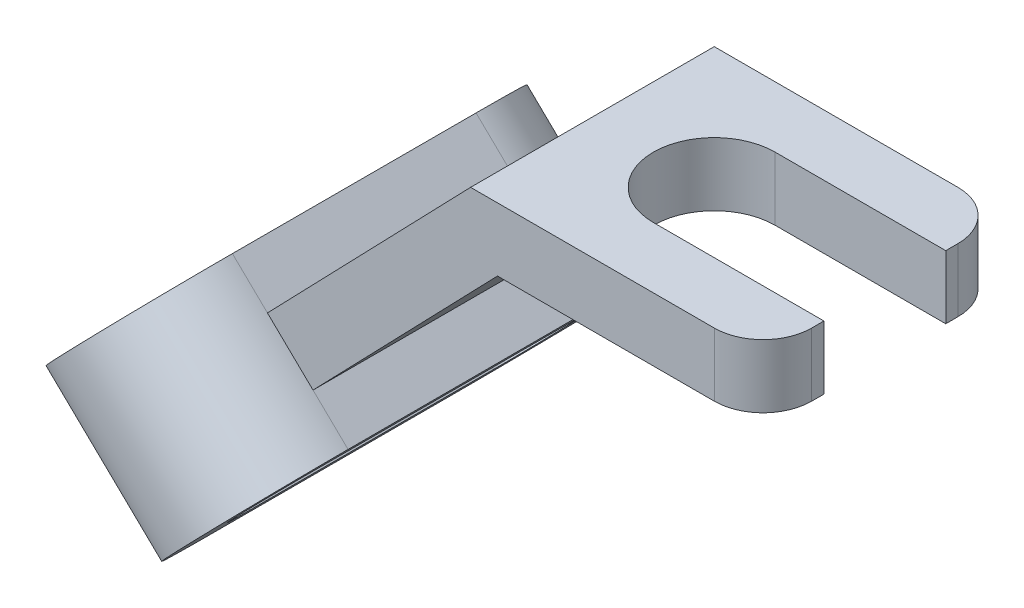
ISO-10303-21;
HEADER;
FILE_DESCRIPTION(('STEP AP214'),'2;1');
FILE_NAME('part.step','',(''),(''),'','','');
FILE_SCHEMA(('AUTOMOTIVE_DESIGN { 1 0 10303 214 1 1 1 1 }'));
ENDSEC;
DATA;
#1=APPLICATION_CONTEXT('core data for automotive mechanical design processes');
#2=APPLICATION_PROTOCOL_DEFINITION('international standard','automotive_design',2000,#1);
#3=PRODUCT_CONTEXT('',#1,'mechanical');
#4=PRODUCT('Part','Part','',(#3));
#5=PRODUCT_RELATED_PRODUCT_CATEGORY('part','',(#4));
#6=PRODUCT_DEFINITION_FORMATION('','',#4);
#7=PRODUCT_DEFINITION_CONTEXT('part definition',#1,'design');
#8=PRODUCT_DEFINITION('design','',#6,#7);
#9=PRODUCT_DEFINITION_SHAPE('','',#8);
#10=(LENGTH_UNIT() NAMED_UNIT(*) SI_UNIT(.MILLI.,.METRE.));
#11=(NAMED_UNIT(*) PLANE_ANGLE_UNIT() SI_UNIT($,.RADIAN.));
#12=(NAMED_UNIT(*) SI_UNIT($,.STERADIAN.) SOLID_ANGLE_UNIT());
#13=UNCERTAINTY_MEASURE_WITH_UNIT(LENGTH_MEASURE(1.E-05),#10,'distance_accuracy_value','');
#14=(GEOMETRIC_REPRESENTATION_CONTEXT(3) GLOBAL_UNCERTAINTY_ASSIGNED_CONTEXT((#13)) GLOBAL_UNIT_ASSIGNED_CONTEXT((#10,
#11,#12)) REPRESENTATION_CONTEXT('',''));
#15=CARTESIAN_POINT('',(0.,0.,0.));
#16=DIRECTION('',(0.,0.,1.));
#17=DIRECTION('',(1.,0.,0.));
#18=AXIS2_PLACEMENT_3D('',#15,#16,#17);
#19=CARTESIAN_POINT('',(54.4818273892751,0.,50.));
#20=DIRECTION('',(-1.,0.,0.));
#21=DIRECTION('',(0.,0.,1.));
#22=AXIS2_PLACEMENT_3D('',#19,#20,#21);
#23=PLANE('',#22);
#24=DIRECTION('',(0.,0.,-1.));
#25=VECTOR('',#24,1.);
#26=CARTESIAN_POINT('',(54.4818273892751,0.,50.));
#27=LINE('',#26,#25);
#28=CARTESIAN_POINT('',(54.4818273892751,0.,12.5));
#29=VERTEX_POINT('',#28);
#30=CARTESIAN_POINT('',(54.4818273892751,0.,10.));
#31=VERTEX_POINT('',#30);
#32=EDGE_CURVE('E340',#29,#31,#27,.T.);
#33=ORIENTED_EDGE('',*,*,#32,.T.);
#34=DIRECTION('',(0.,1.,0.));
#35=VECTOR('',#34,1.);
#36=CARTESIAN_POINT('',(54.4818273892751,13.,10.));
#37=LINE('',#36,#35);
#38=CARTESIAN_POINT('',(54.4818273892751,13.,10.));
#39=VERTEX_POINT('',#38);
#40=EDGE_CURVE('E359',#31,#39,#37,.T.);
#41=ORIENTED_EDGE('',*,*,#40,.T.);
#42=DIRECTION('',(0.,0.,-1.));
#43=VECTOR('',#42,1.);
#44=CARTESIAN_POINT('',(54.4818273892751,13.,50.));
#45=LINE('',#44,#43);
#46=CARTESIAN_POINT('',(54.4818273892751,13.,12.5));
#47=VERTEX_POINT('',#46);
#48=EDGE_CURVE('E325',#47,#39,#45,.T.);
#49=ORIENTED_EDGE('',*,*,#48,.F.);
#50=DIRECTION('',(0.,1.,0.));
#51=VECTOR('',#50,1.);
#52=CARTESIAN_POINT('',(54.4818273892751,-74.9121225544221,12.5));
#53=LINE('',#52,#51);
#54=EDGE_CURVE('E654',#29,#47,#53,.T.);
#55=ORIENTED_EDGE('',*,*,#54,.F.);
#56=EDGE_LOOP('',(#33,#41,#49,#55));
#57=FACE_BOUND('',#56,.T.);
#58=ADVANCED_FACE('F39',(#57),#23,.F.);
#59=CARTESIAN_POINT('',(-5.51817261072488,13.,50.));
#60=DIRECTION('',(0.719339800338652,-0.694658370458996,0.));
#61=DIRECTION('',(0.694658370458996,0.719339800338652,0.));
#62=AXIS2_PLACEMENT_3D('',#59,#60,#61);
#63=PLANE('',#62);
#64=DIRECTION('',(0.,0.,-1.));
#65=VECTOR('',#64,1.);
#66=CARTESIAN_POINT('',(-47.1976748382646,-30.1603880203191,50.));
#67=LINE('',#66,#65);
#68=CARTESIAN_POINT('',(-47.1976748382646,-30.1603880203191,50.));
#69=VERTEX_POINT('',#68);
#70=CARTESIAN_POINT('',(-47.1976748382646,-30.1603880203191,0.));
#71=VERTEX_POINT('',#70);
#72=EDGE_CURVE('E305',#69,#71,#67,.T.);
#73=ORIENTED_EDGE('',*,*,#72,.F.);
#74=DIRECTION('',(-0.694658370458996,-0.719339800338652,0.));
#75=VECTOR('',#74,1.);
#76=CARTESIAN_POINT('',(-5.51817261072488,13.,50.));
#77=LINE('',#76,#75);
#78=CARTESIAN_POINT('',(-5.51817261072488,13.,50.));
#79=VERTEX_POINT('',#78);
#80=EDGE_CURVE('E313',#79,#69,#77,.T.);
#81=ORIENTED_EDGE('',*,*,#80,.F.);
#82=DIRECTION('',(0.,0.,-1.));
#83=VECTOR('',#82,1.);
#84=CARTESIAN_POINT('',(-5.51817261072488,13.,50.));
#85=LINE('',#84,#83);
#86=CARTESIAN_POINT('',(-5.51817261072488,13.,0.));
#87=VERTEX_POINT('',#86);
#88=EDGE_CURVE('E348',#79,#87,#85,.T.);
#89=ORIENTED_EDGE('',*,*,#88,.T.);
#90=DIRECTION('',(-0.694658370458996,-0.719339800338652,0.));
#91=VECTOR('',#90,1.);
#92=CARTESIAN_POINT('',(-5.51817261072488,13.,0.));
#93=LINE('',#92,#91);
#94=EDGE_CURVE('E328',#87,#71,#93,.T.);
#95=ORIENTED_EDGE('',*,*,#94,.T.);
#96=EDGE_LOOP('',(#73,#81,#89,#95));
#97=FACE_BOUND('',#96,.T.);
#98=ADVANCED_FACE('F390',(#97),#63,.F.);
#99=CARTESIAN_POINT('',(0.,0.,50.));
#100=DIRECTION('',(0.719339800338653,-0.694658370458996,0.));
#101=DIRECTION('',(0.694658370458996,0.719339800338653,0.));
#102=AXIS2_PLACEMENT_3D('',#99,#100,#101);
#103=PLANE('',#102);
#104=DIRECTION('',(-0.694658370458996,-0.719339800338653,0.));
#105=VECTOR('',#104,1.);
#106=CARTESIAN_POINT('',(0.,0.,50.));
#107=LINE('',#106,#105);
#108=CARTESIAN_POINT('',(0.,0.,50.));
#109=VERTEX_POINT('',#108);
#110=CARTESIAN_POINT('',(-37.8462574338621,-39.1909468362861,50.));
#111=VERTEX_POINT('',#110);
#112=EDGE_CURVE('E318',#109,#111,#107,.T.);
#113=ORIENTED_EDGE('',*,*,#112,.T.);
#114=DIRECTION('',(0.,0.,-1.));
#115=VECTOR('',#114,1.);
#116=CARTESIAN_POINT('',(-37.8462574338622,-39.1909468362861,50.));
#117=LINE('',#116,#115);
#118=CARTESIAN_POINT('',(-37.8462574338621,-39.1909468362861,0.));
#119=VERTEX_POINT('',#118);
#120=EDGE_CURVE('E301',#111,#119,#117,.T.);
#121=ORIENTED_EDGE('',*,*,#120,.T.);
#122=DIRECTION('',(-0.694658370458996,-0.719339800338653,0.));
#123=VECTOR('',#122,1.);
#124=CARTESIAN_POINT('',(0.,0.,0.));
#125=LINE('',#124,#123);
#126=CARTESIAN_POINT('',(0.,0.,0.));
#127=VERTEX_POINT('',#126);
#128=EDGE_CURVE('E332',#127,#119,#125,.T.);
#129=ORIENTED_EDGE('',*,*,#128,.F.);
#130=DIRECTION('',(0.,0.,-1.));
#131=VECTOR('',#130,1.);
#132=CARTESIAN_POINT('',(0.,0.,50.));
#133=LINE('',#132,#131);
#134=EDGE_CURVE('E344',#109,#127,#133,.T.);
#135=ORIENTED_EDGE('',*,*,#134,.F.);
#136=EDGE_LOOP('',(#113,#121,#129,#135));
#137=FACE_BOUND('',#136,.T.);
#138=ADVANCED_FACE('F397',(#137),#103,.T.);
#139=CARTESIAN_POINT('',(0.,0.,50.));
#140=DIRECTION('',(0.,0.,-1.));
#141=DIRECTION('',(-1.,0.,0.));
#142=AXIS2_PLACEMENT_3D('',#139,#140,#141);
#143=PLANE('',#142);
#144=DIRECTION('',(-1.,0.,0.));
#145=VECTOR('',#144,1.);
#146=CARTESIAN_POINT('',(54.4818273892751,0.,50.));
#147=LINE('',#146,#145);
#148=CARTESIAN_POINT('',(44.4818273892751,0.,50.));
#149=VERTEX_POINT('',#148);
#150=EDGE_CURVE('E322',#149,#109,#147,.T.);
#151=ORIENTED_EDGE('',*,*,#150,.F.);
#152=DIRECTION('',(0.,1.,0.));
#153=VECTOR('',#152,1.);
#154=CARTESIAN_POINT('',(44.4818273892751,0.,50.));
#155=LINE('',#154,#153);
#156=CARTESIAN_POINT('',(44.4818273892751,13.,50.));
#157=VERTEX_POINT('',#156);
#158=EDGE_CURVE('E48',#149,#157,#155,.T.);
#159=ORIENTED_EDGE('',*,*,#158,.T.);
#160=DIRECTION('',(-1.,0.,0.));
#161=VECTOR('',#160,1.);
#162=CARTESIAN_POINT('',(54.4818273892751,13.,50.));
#163=LINE('',#162,#161);
#164=EDGE_CURVE('E310',#157,#79,#163,.T.);
#165=ORIENTED_EDGE('',*,*,#164,.T.);
#166=ORIENTED_EDGE('',*,*,#80,.T.);
#167=DIRECTION('',(-0.719339800338652,0.694658370458996,0.));
#168=VECTOR('',#167,1.);
#169=CARTESIAN_POINT('',(-30.6528594304756,-46.1375305408761,50.));
#170=LINE('',#169,#168);
#171=EDGE_CURVE('E288',#111,#69,#170,.T.);
#172=ORIENTED_EDGE('',*,*,#171,.F.);
#173=ORIENTED_EDGE('',*,*,#112,.F.);
#174=EDGE_LOOP('',(#151,#159,#165,#166,#172,#173));
#175=FACE_BOUND('',#174,.T.);
#176=ADVANCED_FACE('F381',(#175),#143,.F.);
#177=CARTESIAN_POINT('',(0.,0.,0.));
#178=DIRECTION('',(0.,0.,-1.));
#179=DIRECTION('',(-1.,0.,0.));
#180=AXIS2_PLACEMENT_3D('',#177,#178,#179);
#181=PLANE('',#180);
#182=DIRECTION('',(-1.,0.,0.));
#183=VECTOR('',#182,1.);
#184=CARTESIAN_POINT('',(54.4818273892751,13.,0.));
#185=LINE('',#184,#183);
#186=CARTESIAN_POINT('',(44.4818273892751,13.,0.));
#187=VERTEX_POINT('',#186);
#188=EDGE_CURVE('E309',#187,#87,#185,.T.);
#189=ORIENTED_EDGE('',*,*,#188,.F.);
#190=DIRECTION('',(0.,1.,0.));
#191=VECTOR('',#190,1.);
#192=CARTESIAN_POINT('',(44.4818273892751,0.,0.));
#193=LINE('',#192,#191);
#194=CARTESIAN_POINT('',(44.4818273892751,0.,0.));
#195=VERTEX_POINT('',#194);
#196=EDGE_CURVE('E369',#187,#195,#193,.F.);
#197=ORIENTED_EDGE('',*,*,#196,.T.);
#198=DIRECTION('',(-1.,0.,0.));
#199=VECTOR('',#198,1.);
#200=CARTESIAN_POINT('',(54.4818273892751,0.,0.));
#201=LINE('',#200,#199);
#202=EDGE_CURVE('E314',#195,#127,#201,.T.);
#203=ORIENTED_EDGE('',*,*,#202,.T.);
#204=ORIENTED_EDGE('',*,*,#128,.T.);
#205=DIRECTION('',(-0.719339800338653,0.694658370458996,0.));
#206=VECTOR('',#205,1.);
#207=CARTESIAN_POINT('',(-37.8462574338622,-39.1909468362861,0.));
#208=LINE('',#207,#206);
#209=EDGE_CURVE('E355',#119,#71,#208,.T.);
#210=ORIENTED_EDGE('',*,*,#209,.T.);
#211=ORIENTED_EDGE('',*,*,#94,.F.);
#212=EDGE_LOOP('',(#189,#197,#203,#204,#210,#211));
#213=FACE_BOUND('',#212,.T.);
#214=ADVANCED_FACE('F441',(#213),#181,.T.);
#215=CARTESIAN_POINT('',(54.4818273892751,13.,50.));
#216=DIRECTION('',(0.,-1.,0.));
#217=DIRECTION('',(1.,0.,0.));
#218=AXIS2_PLACEMENT_3D('',#215,#216,#217);
#219=PLANE('',#218);
#220=ORIENTED_EDGE('',*,*,#48,.T.);
#221=CARTESIAN_POINT('',(44.4818273892751,13.,10.));
#222=DIRECTION('',(0.,-1.,0.));
#223=DIRECTION('',(1.,0.,0.));
#224=AXIS2_PLACEMENT_3D('',#221,#222,#223);
#225=CIRCLE('',#224,10.);
#226=EDGE_CURVE('E366',#39,#187,#225,.F.);
#227=ORIENTED_EDGE('',*,*,#226,.T.);
#228=ORIENTED_EDGE('',*,*,#188,.T.);
#229=ORIENTED_EDGE('',*,*,#88,.F.);
#230=ORIENTED_EDGE('',*,*,#164,.F.);
#231=CARTESIAN_POINT('',(44.4818273892751,13.,40.));
#232=DIRECTION('',(0.,-1.,0.));
#233=DIRECTION('',(1.,0.,0.));
#234=AXIS2_PLACEMENT_3D('',#231,#232,#233);
#235=CIRCLE('',#234,10.);
#236=CARTESIAN_POINT('',(54.4818273892751,13.,40.));
#237=VERTEX_POINT('',#236);
#238=EDGE_CURVE('E363',#157,#237,#235,.F.);
#239=ORIENTED_EDGE('',*,*,#238,.T.);
#240=CARTESIAN_POINT('',(54.4818273892751,13.,37.5));
#241=VERTEX_POINT('',#240);
#242=EDGE_CURVE('E203',#237,#241,#45,.T.);
#243=ORIENTED_EDGE('',*,*,#242,.T.);
#244=DIRECTION('',(1.,0.,0.));
#245=VECTOR('',#244,1.);
#246=CARTESIAN_POINT('',(19.4818273892751,13.,37.5));
#247=LINE('',#246,#245);
#248=CARTESIAN_POINT('',(19.4818273892751,13.,37.5));
#249=VERTEX_POINT('',#248);
#250=EDGE_CURVE('E181',#249,#241,#247,.T.);
#251=ORIENTED_EDGE('',*,*,#250,.F.);
#252=CARTESIAN_POINT('',(19.4818273892751,13.,25.));
#253=DIRECTION('',(0.,1.,0.));
#254=DIRECTION('',(-1.,0.,0.));
#255=AXIS2_PLACEMENT_3D('',#252,#253,#254);
#256=CIRCLE('',#255,12.5);
#257=CARTESIAN_POINT('',(19.4818273892751,13.,12.5));
#258=VERTEX_POINT('',#257);
#259=EDGE_CURVE('E193',#258,#249,#256,.T.);
#260=ORIENTED_EDGE('',*,*,#259,.F.);
#261=DIRECTION('',(-1.,0.,0.));
#262=VECTOR('',#261,1.);
#263=CARTESIAN_POINT('',(19.4818273892751,13.,12.5));
#264=LINE('',#263,#262);
#265=EDGE_CURVE('E190',#47,#258,#264,.T.);
#266=ORIENTED_EDGE('',*,*,#265,.F.);
#267=EDGE_LOOP('',(#220,#227,#228,#229,#230,#239,#243,#251,#260,#266));
#268=FACE_BOUND('',#267,.T.);
#269=ADVANCED_FACE('F202',(#268),#219,.F.);
#270=CARTESIAN_POINT('',(54.4818273892751,0.,50.));
#271=DIRECTION('',(0.,-1.,0.));
#272=DIRECTION('',(0.,0.,-1.));
#273=AXIS2_PLACEMENT_3D('',#270,#271,#272);
#274=PLANE('',#273);
#275=ORIENTED_EDGE('',*,*,#202,.F.);
#276=CARTESIAN_POINT('',(44.4818273892751,0.,10.));
#277=DIRECTION('',(0.,-1.,0.));
#278=DIRECTION('',(0.,0.,-1.));
#279=AXIS2_PLACEMENT_3D('',#276,#277,#278);
#280=CIRCLE('',#279,10.);
#281=EDGE_CURVE('E374',#195,#31,#280,.T.);
#282=ORIENTED_EDGE('',*,*,#281,.T.);
#283=ORIENTED_EDGE('',*,*,#32,.F.);
#284=DIRECTION('',(-1.,0.,0.));
#285=VECTOR('',#284,1.);
#286=CARTESIAN_POINT('',(19.4818273892751,0.,12.5));
#287=LINE('',#286,#285);
#288=CARTESIAN_POINT('',(19.4818273892751,0.,12.5));
#289=VERTEX_POINT('',#288);
#290=EDGE_CURVE('E199',#29,#289,#287,.T.);
#291=ORIENTED_EDGE('',*,*,#290,.T.);
#292=CARTESIAN_POINT('',(19.4818273892751,0.,25.));
#293=DIRECTION('',(0.,-1.,0.));
#294=DIRECTION('',(0.,0.,-1.));
#295=AXIS2_PLACEMENT_3D('',#292,#293,#294);
#296=CIRCLE('',#295,12.5);
#297=CARTESIAN_POINT('',(19.4818273892751,0.,37.5));
#298=VERTEX_POINT('',#297);
#299=EDGE_CURVE('E657',#289,#298,#296,.F.);
#300=ORIENTED_EDGE('',*,*,#299,.T.);
#301=DIRECTION('',(1.,0.,0.));
#302=VECTOR('',#301,1.);
#303=CARTESIAN_POINT('',(19.4818273892751,0.,37.5));
#304=LINE('',#303,#302);
#305=CARTESIAN_POINT('',(54.4818273892751,0.,37.5));
#306=VERTEX_POINT('',#305);
#307=EDGE_CURVE('E184',#298,#306,#304,.T.);
#308=ORIENTED_EDGE('',*,*,#307,.T.);
#309=CARTESIAN_POINT('',(54.4818273892751,0.,40.));
#310=VERTEX_POINT('',#309);
#311=EDGE_CURVE('E341',#310,#306,#27,.T.);
#312=ORIENTED_EDGE('',*,*,#311,.F.);
#313=CARTESIAN_POINT('',(44.4818273892751,0.,40.));
#314=DIRECTION('',(0.,-1.,0.));
#315=DIRECTION('',(0.,0.,-1.));
#316=AXIS2_PLACEMENT_3D('',#313,#314,#315);
#317=CIRCLE('',#316,10.);
#318=EDGE_CURVE('E55',#310,#149,#317,.T.);
#319=ORIENTED_EDGE('',*,*,#318,.T.);
#320=ORIENTED_EDGE('',*,*,#150,.T.);
#321=ORIENTED_EDGE('',*,*,#134,.T.);
#322=EDGE_LOOP('',(#275,#282,#283,#291,#300,#308,#312,#319,#320,#321));
#323=FACE_BOUND('',#322,.T.);
#324=ADVANCED_FACE('F400',(#323),#274,.T.);
#325=ORIENTED_EDGE('',*,*,#242,.F.);
#326=DIRECTION('',(0.,1.,0.));
#327=VECTOR('',#326,1.);
#328=CARTESIAN_POINT('',(54.4818273892751,0.,40.));
#329=LINE('',#328,#327);
#330=EDGE_CURVE('E11',#237,#310,#329,.F.);
#331=ORIENTED_EDGE('',*,*,#330,.T.);
#332=ORIENTED_EDGE('',*,*,#311,.T.);
#333=DIRECTION('',(0.,-1.,0.));
#334=VECTOR('',#333,1.);
#335=CARTESIAN_POINT('',(54.4818273892751,-74.9121225544221,37.5));
#336=LINE('',#335,#334);
#337=EDGE_CURVE('E465',#241,#306,#336,.T.);
#338=ORIENTED_EDGE('',*,*,#337,.F.);
#339=EDGE_LOOP('',(#325,#331,#332,#338));
#340=FACE_BOUND('',#339,.T.);
#341=ADVANCED_FACE('F452',(#340),#23,.F.);
#342=CARTESIAN_POINT('',(-30.6528594304756,-46.1375305408761,50.));
#343=DIRECTION('',(-0.694658370458996,-0.719339800338652,0.));
#344=DIRECTION('',(0.719339800338653,-0.694658370458996,0.));
#345=AXIS2_PLACEMENT_3D('',#342,#343,#344);
#346=PLANE('',#345);
#347=CARTESIAN_POINT('',(-54.3910728416512,-23.2138043157292,50.));
#348=VERTEX_POINT('',#347);
#349=EDGE_CURVE('E269',#69,#348,#170,.T.);
#350=ORIENTED_EDGE('',*,*,#349,.F.);
#351=ORIENTED_EDGE('',*,*,#72,.T.);
#352=DIRECTION('',(-0.719339800338652,0.694658370458996,0.));
#353=VECTOR('',#352,1.);
#354=CARTESIAN_POINT('',(-30.6528594304756,-46.1375305408761,0.));
#355=LINE('',#354,#353);
#356=CARTESIAN_POINT('',(-54.3910728416512,-23.2138043157292,0.));
#357=VERTEX_POINT('',#356);
#358=EDGE_CURVE('E287',#71,#357,#355,.T.);
#359=ORIENTED_EDGE('',*,*,#358,.T.);
#360=DIRECTION('',(0.,0.,1.));
#361=VECTOR('',#360,1.);
#362=CARTESIAN_POINT('',(-54.3910728416512,-23.2138043157292,50.));
#363=LINE('',#362,#361);
#364=EDGE_CURVE('E260',#357,#348,#363,.T.);
#365=ORIENTED_EDGE('',*,*,#364,.T.);
#366=EDGE_LOOP('',(#350,#351,#359,#365));
#367=FACE_BOUND('',#366,.T.);
#368=ADVANCED_FACE('F421',(#367),#346,.F.);
#369=CARTESIAN_POINT('',(-38.2941015055246,-54.0502683446012,50.));
#370=DIRECTION('',(-0.694658370458996,-0.719339800338652,0.));
#371=DIRECTION('',(0.719339800338653,-0.694658370458996,0.));
#372=AXIS2_PLACEMENT_3D('',#369,#370,#371);
#373=PLANE('',#372);
#374=DIRECTION('',(0.,0.,1.));
#375=VECTOR('',#374,1.);
#376=CARTESIAN_POINT('',(-62.0323149167001,-31.1265421194544,50.));
#377=LINE('',#376,#375);
#378=CARTESIAN_POINT('',(-62.0323149167001,-31.1265421194544,0.));
#379=VERTEX_POINT('',#378);
#380=CARTESIAN_POINT('',(-62.0323149167001,-31.1265421194544,50.));
#381=VERTEX_POINT('',#380);
#382=EDGE_CURVE('E219',#379,#381,#377,.T.);
#383=ORIENTED_EDGE('',*,*,#382,.F.);
#384=DIRECTION('',(-0.719339800338653,0.694658370458996,0.));
#385=VECTOR('',#384,1.);
#386=CARTESIAN_POINT('',(-45.4874995089111,-47.1036846400113,0.));
#387=LINE('',#386,#385);
#388=CARTESIAN_POINT('',(-38.2941015055246,-54.0502683446012,0.));
#389=VERTEX_POINT('',#388);
#390=EDGE_CURVE('E352',#389,#379,#387,.T.);
#391=ORIENTED_EDGE('',*,*,#390,.F.);
#392=DIRECTION('',(0.,0.,1.));
#393=VECTOR('',#392,1.);
#394=CARTESIAN_POINT('',(-38.2941015055246,-54.0502683446012,50.));
#395=LINE('',#394,#393);
#396=CARTESIAN_POINT('',(-38.2941015055246,-54.0502683446012,50.));
#397=VERTEX_POINT('',#396);
#398=EDGE_CURVE('E226',#389,#397,#395,.T.);
#399=ORIENTED_EDGE('',*,*,#398,.T.);
#400=DIRECTION('',(-0.719339800338652,0.694658370458996,0.));
#401=VECTOR('',#400,1.);
#402=CARTESIAN_POINT('',(-38.2941015055246,-54.0502683446012,50.));
#403=LINE('',#402,#401);
#404=EDGE_CURVE('E230',#397,#381,#403,.T.);
#405=ORIENTED_EDGE('',*,*,#404,.T.);
#406=EDGE_LOOP('',(#383,#391,#399,#405));
#407=FACE_BOUND('',#406,.T.);
#408=ADVANCED_FACE('F463',(#407),#373,.T.);
#409=CARTESIAN_POINT('',(-44.5460268396555,-60.5243265476491,50.));
#410=DIRECTION('',(0.719339800338652,-0.694658370458996,0.));
#411=DIRECTION('',(0.694658370458996,0.719339800338652,0.));
#412=AXIS2_PLACEMENT_3D('',#409,#410,#411);
#413=PLANE('',#412);
#414=CARTESIAN_POINT('',(-44.5460268396555,-60.5243265476491,50.));
#415=DIRECTION('',(0.719339800338652,-0.694658370458996,0.));
#416=DIRECTION('',(0.694658370458996,0.719339800338652,0.));
#417=AXIS2_PLACEMENT_3D('',#414,#415,#416);
#418=CIRCLE('',#417,20.);
#419=CARTESIAN_POINT('',(-30.6528594304756,-46.1375305408761,50.));
#420=VERTEX_POINT('',#419);
#421=CARTESIAN_POINT('',(-58.4391942488355,-74.9111225544221,50.));
#422=VERTEX_POINT('',#421);
#423=EDGE_CURVE('E255',#420,#422,#418,.T.);
#424=ORIENTED_EDGE('',*,*,#423,.T.);
#425=DIRECTION('',(0.,0.,-1.));
#426=VECTOR('',#425,1.);
#427=CARTESIAN_POINT('',(-58.4391942488355,-74.9111225544221,50.));
#428=LINE('',#427,#426);
#429=CARTESIAN_POINT('',(-58.4391942488355,-74.9111225544221,0.));
#430=VERTEX_POINT('',#429);
#431=EDGE_CURVE('E259',#422,#430,#428,.T.);
#432=ORIENTED_EDGE('',*,*,#431,.T.);
#433=CARTESIAN_POINT('',(-44.5460268396555,-60.5243265476491,0.));
#434=DIRECTION('',(0.719339800338652,-0.694658370458996,0.));
#435=DIRECTION('',(0.694658370458996,0.719339800338652,0.));
#436=AXIS2_PLACEMENT_3D('',#433,#434,#435);
#437=CIRCLE('',#436,20.);
#438=CARTESIAN_POINT('',(-30.6528594304756,-46.1375305408761,0.));
#439=VERTEX_POINT('',#438);
#440=EDGE_CURVE('E263',#430,#439,#437,.T.);
#441=ORIENTED_EDGE('',*,*,#440,.T.);
#442=DIRECTION('',(0.,0.,1.));
#443=VECTOR('',#442,1.);
#444=CARTESIAN_POINT('',(-30.6528594304756,-46.1375305408761,50.));
#445=LINE('',#444,#443);
#446=EDGE_CURVE('E266',#439,#420,#445,.T.);
#447=ORIENTED_EDGE('',*,*,#446,.T.);
#448=EDGE_LOOP('',(#424,#432,#441,#447));
#449=FACE_BOUND('',#448,.T.);
#450=DIRECTION('',(0.,0.,-1.));
#451=VECTOR('',#450,1.);
#452=CARTESIAN_POINT('',(-50.7979521737865,-66.998384750697,50.));
#453=LINE('',#452,#451);
#454=CARTESIAN_POINT('',(-50.7979521737865,-66.998384750697,50.));
#455=VERTEX_POINT('',#454);
#456=CARTESIAN_POINT('',(-50.7979521737865,-66.998384750697,0.));
#457=VERTEX_POINT('',#456);
#458=EDGE_CURVE('E218',#455,#457,#453,.T.);
#459=ORIENTED_EDGE('',*,*,#458,.F.);
#460=CARTESIAN_POINT('',(-44.5460268396555,-60.5243265476491,50.));
#461=DIRECTION('',(0.719339800338652,-0.694658370458996,0.));
#462=DIRECTION('',(0.694658370458996,0.719339800338652,0.));
#463=AXIS2_PLACEMENT_3D('',#460,#461,#462);
#464=CIRCLE('',#463,8.99999999999999);
#465=EDGE_CURVE('E215',#397,#455,#464,.T.);
#466=ORIENTED_EDGE('',*,*,#465,.F.);
#467=ORIENTED_EDGE('',*,*,#398,.F.);
#468=CARTESIAN_POINT('',(-44.5460268396555,-60.5243265476491,0.));
#469=DIRECTION('',(0.719339800338652,-0.694658370458996,0.));
#470=DIRECTION('',(0.694658370458996,0.719339800338652,0.));
#471=AXIS2_PLACEMENT_3D('',#468,#469,#470);
#472=CIRCLE('',#471,8.99999999999999);
#473=EDGE_CURVE('E222',#457,#389,#472,.T.);
#474=ORIENTED_EDGE('',*,*,#473,.F.);
#475=EDGE_LOOP('',(#459,#466,#467,#474));
#476=FACE_BOUND('',#475,.T.);
#477=ADVANCED_FACE('F432',(#449,#476),#413,.T.);
#478=CARTESIAN_POINT('',(-68.2842402508311,-37.6006003225022,50.));
#479=DIRECTION('',(0.719339800338652,-0.694658370458996,0.));
#480=DIRECTION('',(0.694658370458996,0.719339800338652,0.));
#481=AXIS2_PLACEMENT_3D('',#478,#479,#480);
#482=PLANE('',#481);
#483=CARTESIAN_POINT('',(-68.2842402508311,-37.6006003225022,50.));
#484=DIRECTION('',(0.719339800338652,-0.694658370458996,0.));
#485=DIRECTION('',(0.694658370458996,0.719339800338652,0.));
#486=AXIS2_PLACEMENT_3D('',#483,#484,#485);
#487=CIRCLE('',#486,20.);
#488=CARTESIAN_POINT('',(-82.177407660011,-51.9873963292753,50.));
#489=VERTEX_POINT('',#488);
#490=EDGE_CURVE('E254',#348,#489,#487,.T.);
#491=ORIENTED_EDGE('',*,*,#490,.F.);
#492=ORIENTED_EDGE('',*,*,#364,.F.);
#493=CARTESIAN_POINT('',(-68.2842402508311,-37.6006003225022,0.));
#494=DIRECTION('',(0.719339800338652,-0.694658370458996,0.));
#495=DIRECTION('',(0.694658370458996,0.719339800338652,0.));
#496=AXIS2_PLACEMENT_3D('',#493,#494,#495);
#497=CIRCLE('',#496,20.);
#498=CARTESIAN_POINT('',(-82.177407660011,-51.9873963292753,0.));
#499=VERTEX_POINT('',#498);
#500=EDGE_CURVE('E276',#499,#357,#497,.T.);
#501=ORIENTED_EDGE('',*,*,#500,.F.);
#502=DIRECTION('',(0.,0.,-1.));
#503=VECTOR('',#502,1.);
#504=CARTESIAN_POINT('',(-82.177407660011,-51.9873963292753,50.));
#505=LINE('',#504,#503);
#506=EDGE_CURVE('E273',#489,#499,#505,.T.);
#507=ORIENTED_EDGE('',*,*,#506,.F.);
#508=EDGE_LOOP('',(#491,#492,#501,#507));
#509=FACE_BOUND('',#508,.T.);
#510=CARTESIAN_POINT('',(-68.2842402508311,-37.6006003225022,50.));
#511=DIRECTION('',(0.719339800338652,-0.694658370458996,0.));
#512=DIRECTION('',(0.694658370458996,0.719339800338652,0.));
#513=AXIS2_PLACEMENT_3D('',#510,#511,#512);
#514=CIRCLE('',#513,8.99999999999999);
#515=CARTESIAN_POINT('',(-74.536165584962,-44.0746585255501,50.));
#516=VERTEX_POINT('',#515);
#517=EDGE_CURVE('E214',#381,#516,#514,.T.);
#518=ORIENTED_EDGE('',*,*,#517,.T.);
#519=DIRECTION('',(0.,0.,-1.));
#520=VECTOR('',#519,1.);
#521=CARTESIAN_POINT('',(-74.536165584962,-44.0746585255501,50.));
#522=LINE('',#521,#520);
#523=CARTESIAN_POINT('',(-74.536165584962,-44.0746585255501,0.));
#524=VERTEX_POINT('',#523);
#525=EDGE_CURVE('E234',#516,#524,#522,.T.);
#526=ORIENTED_EDGE('',*,*,#525,.T.);
#527=CARTESIAN_POINT('',(-68.2842402508311,-37.6006003225022,0.));
#528=DIRECTION('',(0.719339800338652,-0.694658370458996,0.));
#529=DIRECTION('',(0.694658370458996,0.719339800338652,0.));
#530=AXIS2_PLACEMENT_3D('',#527,#528,#529);
#531=CIRCLE('',#530,8.99999999999999);
#532=EDGE_CURVE('E238',#524,#379,#531,.T.);
#533=ORIENTED_EDGE('',*,*,#532,.T.);
#534=ORIENTED_EDGE('',*,*,#382,.T.);
#535=EDGE_LOOP('',(#518,#526,#533,#534));
#536=FACE_BOUND('',#535,.T.);
#537=ADVANCED_FACE('F424',(#509,#536),#482,.F.);
#538=CARTESIAN_POINT('',(-44.5460268396555,-60.5243265476491,50.));
#539=DIRECTION('',(-0.719339800338652,0.694658370458996,0.));
#540=DIRECTION('',(-0.694658370458996,-0.719339800338653,0.));
#541=AXIS2_PLACEMENT_3D('',#538,#539,#540);
#542=CYLINDRICAL_SURFACE('',#541,20.);
#543=ORIENTED_EDGE('',*,*,#490,.T.);
#544=DIRECTION('',(-0.719339800338652,0.694658370458996,0.));
#545=VECTOR('',#544,1.);
#546=CARTESIAN_POINT('',(-58.4391942488355,-74.9111225544221,50.));
#547=LINE('',#546,#545);
#548=EDGE_CURVE('E297',#422,#489,#547,.T.);
#549=ORIENTED_EDGE('',*,*,#548,.F.);
#550=ORIENTED_EDGE('',*,*,#423,.F.);
#551=EDGE_CURVE('E283',#420,#111,#170,.T.);
#552=ORIENTED_EDGE('',*,*,#551,.T.);
#553=ORIENTED_EDGE('',*,*,#171,.T.);
#554=ORIENTED_EDGE('',*,*,#349,.T.);
#555=EDGE_LOOP('',(#543,#549,#550,#552,#553,#554));
#556=FACE_BOUND('',#555,.T.);
#557=ADVANCED_FACE('F416',(#556),#542,.T.);
#558=CARTESIAN_POINT('',(-58.4391942488355,-74.9111225544221,50.));
#559=DIRECTION('',(0.694658370458996,0.719339800338652,0.));
#560=DIRECTION('',(-0.719339800338653,0.694658370458996,0.));
#561=AXIS2_PLACEMENT_3D('',#558,#559,#560);
#562=PLANE('',#561);
#563=ORIENTED_EDGE('',*,*,#506,.T.);
#564=DIRECTION('',(-0.719339800338652,0.694658370458996,0.));
#565=VECTOR('',#564,1.);
#566=CARTESIAN_POINT('',(-58.4391942488355,-74.9111225544221,0.));
#567=LINE('',#566,#565);
#568=EDGE_CURVE('E293',#430,#499,#567,.T.);
#569=ORIENTED_EDGE('',*,*,#568,.F.);
#570=ORIENTED_EDGE('',*,*,#431,.F.);
#571=ORIENTED_EDGE('',*,*,#548,.T.);
#572=EDGE_LOOP('',(#563,#569,#570,#571));
#573=FACE_BOUND('',#572,.T.);
#574=ADVANCED_FACE('F428',(#573),#562,.F.);
#575=CARTESIAN_POINT('',(-44.5460268396555,-60.5243265476491,0.));
#576=DIRECTION('',(-0.719339800338652,0.694658370458996,0.));
#577=DIRECTION('',(-0.694658370458996,-0.719339800338653,0.));
#578=AXIS2_PLACEMENT_3D('',#575,#576,#577);
#579=CYLINDRICAL_SURFACE('',#578,20.);
#580=ORIENTED_EDGE('',*,*,#500,.T.);
#581=ORIENTED_EDGE('',*,*,#358,.F.);
#582=ORIENTED_EDGE('',*,*,#209,.F.);
#583=EDGE_CURVE('E289',#439,#119,#355,.T.);
#584=ORIENTED_EDGE('',*,*,#583,.F.);
#585=ORIENTED_EDGE('',*,*,#440,.F.);
#586=ORIENTED_EDGE('',*,*,#568,.T.);
#587=EDGE_LOOP('',(#580,#581,#582,#584,#585,#586));
#588=FACE_BOUND('',#587,.T.);
#589=ADVANCED_FACE('F440',(#588),#579,.T.);
#590=ORIENTED_EDGE('',*,*,#120,.F.);
#591=ORIENTED_EDGE('',*,*,#551,.F.);
#592=ORIENTED_EDGE('',*,*,#446,.F.);
#593=ORIENTED_EDGE('',*,*,#583,.T.);
#594=EDGE_LOOP('',(#590,#591,#592,#593));
#595=FACE_BOUND('',#594,.T.);
#596=ADVANCED_FACE('F438',(#595),#346,.F.);
#597=CARTESIAN_POINT('',(-44.5460268396555,-60.5243265476491,50.));
#598=DIRECTION('',(-0.719339800338652,0.694658370458996,0.));
#599=DIRECTION('',(-0.694658370458996,-0.719339800338653,0.));
#600=AXIS2_PLACEMENT_3D('',#597,#598,#599);
#601=CYLINDRICAL_SURFACE('',#600,8.99999999999999);
#602=ORIENTED_EDGE('',*,*,#517,.F.);
#603=ORIENTED_EDGE('',*,*,#404,.F.);
#604=ORIENTED_EDGE('',*,*,#465,.T.);
#605=DIRECTION('',(-0.719339800338652,0.694658370458996,0.));
#606=VECTOR('',#605,1.);
#607=CARTESIAN_POINT('',(-50.7979521737865,-66.998384750697,50.));
#608=LINE('',#607,#606);
#609=EDGE_CURVE('E250',#455,#516,#608,.T.);
#610=ORIENTED_EDGE('',*,*,#609,.T.);
#611=EDGE_LOOP('',(#602,#603,#604,#610));
#612=FACE_BOUND('',#611,.T.);
#613=ADVANCED_FACE('F572',(#612),#601,.F.);
#614=CARTESIAN_POINT('',(-50.7979521737865,-66.998384750697,50.));
#615=DIRECTION('',(0.694658370458996,0.719339800338652,0.));
#616=DIRECTION('',(-0.719339800338653,0.694658370458996,0.));
#617=AXIS2_PLACEMENT_3D('',#614,#615,#616);
#618=PLANE('',#617);
#619=ORIENTED_EDGE('',*,*,#525,.F.);
#620=ORIENTED_EDGE('',*,*,#609,.F.);
#621=ORIENTED_EDGE('',*,*,#458,.T.);
#622=DIRECTION('',(-0.719339800338652,0.694658370458996,0.));
#623=VECTOR('',#622,1.);
#624=CARTESIAN_POINT('',(-50.7979521737865,-66.998384750697,0.));
#625=LINE('',#624,#623);
#626=EDGE_CURVE('E247',#457,#524,#625,.T.);
#627=ORIENTED_EDGE('',*,*,#626,.T.);
#628=EDGE_LOOP('',(#619,#620,#621,#627));
#629=FACE_BOUND('',#628,.T.);
#630=ADVANCED_FACE('F564',(#629),#618,.T.);
#631=CARTESIAN_POINT('',(-44.5460268396555,-60.5243265476491,0.));
#632=DIRECTION('',(-0.719339800338652,0.694658370458996,0.));
#633=DIRECTION('',(-0.694658370458996,-0.719339800338653,0.));
#634=AXIS2_PLACEMENT_3D('',#631,#632,#633);
#635=CYLINDRICAL_SURFACE('',#634,8.99999999999999);
#636=ORIENTED_EDGE('',*,*,#532,.F.);
#637=ORIENTED_EDGE('',*,*,#626,.F.);
#638=ORIENTED_EDGE('',*,*,#473,.T.);
#639=ORIENTED_EDGE('',*,*,#390,.T.);
#640=EDGE_LOOP('',(#636,#637,#638,#639));
#641=FACE_BOUND('',#640,.T.);
#642=ADVANCED_FACE('F538',(#641),#635,.F.);
#643=CARTESIAN_POINT('',(19.4818273892751,-74.9121225544221,25.));
#644=DIRECTION('',(0.,1.,0.));
#645=DIRECTION('',(-1.,0.,0.));
#646=AXIS2_PLACEMENT_3D('',#643,#644,#645);
#647=CYLINDRICAL_SURFACE('',#646,12.5);
#648=DIRECTION('',(0.,1.,0.));
#649=VECTOR('',#648,1.);
#650=CARTESIAN_POINT('',(19.4818273892751,-74.9121225544221,12.5));
#651=LINE('',#650,#649);
#652=EDGE_CURVE('E189',#289,#258,#651,.T.);
#653=ORIENTED_EDGE('',*,*,#652,.T.);
#654=ORIENTED_EDGE('',*,*,#259,.T.);
#655=DIRECTION('',(0.,1.,0.));
#656=VECTOR('',#655,1.);
#657=CARTESIAN_POINT('',(19.4818273892751,-74.9121225544221,37.5));
#658=LINE('',#657,#656);
#659=EDGE_CURVE('E176',#298,#249,#658,.T.);
#660=ORIENTED_EDGE('',*,*,#659,.F.);
#661=ORIENTED_EDGE('',*,*,#299,.F.);
#662=EDGE_LOOP('',(#653,#654,#660,#661));
#663=FACE_BOUND('',#662,.T.);
#664=ADVANCED_FACE('F194',(#663),#647,.F.);
#665=CARTESIAN_POINT('',(19.4818273892751,-74.9121225544221,12.5));
#666=DIRECTION('',(0.,0.,-1.));
#667=DIRECTION('',(-1.,0.,0.));
#668=AXIS2_PLACEMENT_3D('',#665,#666,#667);
#669=PLANE('',#668);
#670=ORIENTED_EDGE('',*,*,#54,.T.);
#671=ORIENTED_EDGE('',*,*,#265,.T.);
#672=ORIENTED_EDGE('',*,*,#652,.F.);
#673=ORIENTED_EDGE('',*,*,#290,.F.);
#674=EDGE_LOOP('',(#670,#671,#672,#673));
#675=FACE_BOUND('',#674,.T.);
#676=ADVANCED_FACE('F473',(#675),#669,.F.);
#677=CARTESIAN_POINT('',(19.4818273892751,-74.9121225544221,37.5));
#678=DIRECTION('',(0.,0.,1.));
#679=DIRECTION('',(1.,0.,0.));
#680=AXIS2_PLACEMENT_3D('',#677,#678,#679);
#681=PLANE('',#680);
#682=ORIENTED_EDGE('',*,*,#659,.T.);
#683=ORIENTED_EDGE('',*,*,#250,.T.);
#684=ORIENTED_EDGE('',*,*,#337,.T.);
#685=ORIENTED_EDGE('',*,*,#307,.F.);
#686=EDGE_LOOP('',(#682,#683,#684,#685));
#687=FACE_BOUND('',#686,.T.);
#688=ADVANCED_FACE('F178',(#687),#681,.F.);
#689=CARTESIAN_POINT('',(44.4818273892751,0.,10.));
#690=DIRECTION('',(0.,-1.,0.));
#691=DIRECTION('',(0.,0.,-1.));
#692=AXIS2_PLACEMENT_3D('',#689,#690,#691);
#693=CYLINDRICAL_SURFACE('',#692,10.);
#694=ORIENTED_EDGE('',*,*,#281,.F.);
#695=ORIENTED_EDGE('',*,*,#196,.F.);
#696=ORIENTED_EDGE('',*,*,#226,.F.);
#697=ORIENTED_EDGE('',*,*,#40,.F.);
#698=EDGE_LOOP('',(#694,#695,#696,#697));
#699=FACE_BOUND('',#698,.T.);
#700=ADVANCED_FACE('F408',(#699),#693,.T.);
#701=CARTESIAN_POINT('',(44.4818273892751,0.,40.));
#702=DIRECTION('',(0.,1.,0.));
#703=DIRECTION('',(0.,0.,1.));
#704=AXIS2_PLACEMENT_3D('',#701,#702,#703);
#705=CYLINDRICAL_SURFACE('',#704,10.);
#706=ORIENTED_EDGE('',*,*,#318,.F.);
#707=ORIENTED_EDGE('',*,*,#330,.F.);
#708=ORIENTED_EDGE('',*,*,#238,.F.);
#709=ORIENTED_EDGE('',*,*,#158,.F.);
#710=EDGE_LOOP('',(#706,#707,#708,#709));
#711=FACE_BOUND('',#710,.T.);
#712=ADVANCED_FACE('F41',(#711),#705,.T.);
#713=CLOSED_SHELL('',(#58,#98,#138,#176,#214,#269,#324,#341,#368,#408,#477,#537,#557,#574,#589,
#596,#613,#630,#642,#664,#676,#688,#700,#712));
#714=MANIFOLD_SOLID_BREP('B2',#713);
#715=ADVANCED_BREP_SHAPE_REPRESENTATION('',(#18,#714),#14);
#716=SHAPE_DEFINITION_REPRESENTATION(#9,#715);
ENDSEC;
END-ISO-10303-21;
